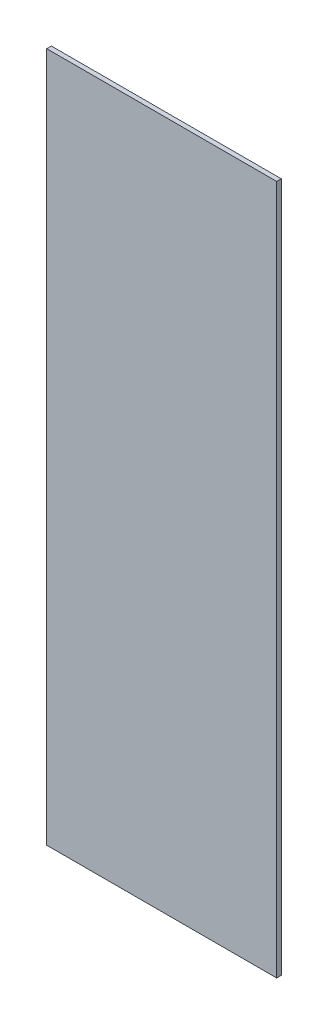
ISO-10303-21;
HEADER;
FILE_DESCRIPTION(('STEP AP214'),'2;1');
FILE_NAME('part.step','',(''),(''),'','','');
FILE_SCHEMA(('AUTOMOTIVE_DESIGN { 1 0 10303 214 1 1 1 1 }'));
ENDSEC;
DATA;
#1=APPLICATION_CONTEXT('core data for automotive mechanical design processes');
#2=APPLICATION_PROTOCOL_DEFINITION('international standard','automotive_design',2000,#1);
#3=PRODUCT_CONTEXT('',#1,'mechanical');
#4=PRODUCT('Part','Part','',(#3));
#5=PRODUCT_RELATED_PRODUCT_CATEGORY('part','',(#4));
#6=PRODUCT_DEFINITION_FORMATION('','',#4);
#7=PRODUCT_DEFINITION_CONTEXT('part definition',#1,'design');
#8=PRODUCT_DEFINITION('design','',#6,#7);
#9=PRODUCT_DEFINITION_SHAPE('','',#8);
#10=(LENGTH_UNIT() NAMED_UNIT(*) SI_UNIT(.MILLI.,.METRE.));
#11=(NAMED_UNIT(*) PLANE_ANGLE_UNIT() SI_UNIT($,.RADIAN.));
#12=(NAMED_UNIT(*) SI_UNIT($,.STERADIAN.) SOLID_ANGLE_UNIT());
#13=UNCERTAINTY_MEASURE_WITH_UNIT(LENGTH_MEASURE(1.E-05),#10,'distance_accuracy_value','');
#14=(GEOMETRIC_REPRESENTATION_CONTEXT(3) GLOBAL_UNCERTAINTY_ASSIGNED_CONTEXT((#13)) GLOBAL_UNIT_ASSIGNED_CONTEXT((#10,
#11,#12)) REPRESENTATION_CONTEXT('',''));
#15=CARTESIAN_POINT('',(0.,0.,0.));
#16=DIRECTION('',(0.,0.,1.));
#17=DIRECTION('',(1.,0.,0.));
#18=AXIS2_PLACEMENT_3D('',#15,#16,#17);
#19=CARTESIAN_POINT('',(-50.,-150.,2.));
#20=DIRECTION('',(1.,0.,0.));
#21=DIRECTION('',(0.,0.,-1.));
#22=AXIS2_PLACEMENT_3D('',#19,#20,#21);
#23=PLANE('',#22);
#24=DIRECTION('',(0.,-1.,0.));
#25=VECTOR('',#24,1.);
#26=CARTESIAN_POINT('',(-50.,-150.,0.));
#27=LINE('',#26,#25);
#28=CARTESIAN_POINT('',(-50.,150.,0.));
#29=VERTEX_POINT('',#28);
#30=CARTESIAN_POINT('',(-50.,-150.,0.));
#31=VERTEX_POINT('',#30);
#32=EDGE_CURVE('E107',#29,#31,#27,.T.);
#33=ORIENTED_EDGE('',*,*,#32,.T.);
#34=DIRECTION('',(0.,0.,-1.));
#35=VECTOR('',#34,1.);
#36=CARTESIAN_POINT('',(-50.,-150.,2.));
#37=LINE('',#36,#35);
#38=CARTESIAN_POINT('',(-50.,-150.,2.));
#39=VERTEX_POINT('',#38);
#40=EDGE_CURVE('E11',#39,#31,#37,.T.);
#41=ORIENTED_EDGE('',*,*,#40,.F.);
#42=DIRECTION('',(0.,-1.,0.));
#43=VECTOR('',#42,1.);
#44=CARTESIAN_POINT('',(-50.,-150.,2.));
#45=LINE('',#44,#43);
#46=CARTESIAN_POINT('',(-50.,150.,2.));
#47=VERTEX_POINT('',#46);
#48=EDGE_CURVE('E91',#47,#39,#45,.T.);
#49=ORIENTED_EDGE('',*,*,#48,.F.);
#50=DIRECTION('',(0.,0.,-1.));
#51=VECTOR('',#50,1.);
#52=CARTESIAN_POINT('',(-50.,150.,2.));
#53=LINE('',#52,#51);
#54=EDGE_CURVE('E103',#47,#29,#53,.T.);
#55=ORIENTED_EDGE('',*,*,#54,.T.);
#56=EDGE_LOOP('',(#33,#41,#49,#55));
#57=FACE_BOUND('',#56,.T.);
#58=ADVANCED_FACE('F39',(#57),#23,.F.);
#59=CARTESIAN_POINT('',(50.,-150.,2.));
#60=DIRECTION('',(0.,1.,0.));
#61=DIRECTION('',(0.,0.,1.));
#62=AXIS2_PLACEMENT_3D('',#59,#60,#61);
#63=PLANE('',#62);
#64=DIRECTION('',(1.,0.,0.));
#65=VECTOR('',#64,1.);
#66=CARTESIAN_POINT('',(50.,-150.,0.));
#67=LINE('',#66,#65);
#68=CARTESIAN_POINT('',(50.,-150.,0.));
#69=VERTEX_POINT('',#68);
#70=EDGE_CURVE('E96',#31,#69,#67,.T.);
#71=ORIENTED_EDGE('',*,*,#70,.T.);
#72=DIRECTION('',(0.,0.,-1.));
#73=VECTOR('',#72,1.);
#74=CARTESIAN_POINT('',(50.,-150.,2.));
#75=LINE('',#74,#73);
#76=CARTESIAN_POINT('',(50.,-150.,2.));
#77=VERTEX_POINT('',#76);
#78=EDGE_CURVE('E48',#77,#69,#75,.T.);
#79=ORIENTED_EDGE('',*,*,#78,.F.);
#80=DIRECTION('',(1.,0.,0.));
#81=VECTOR('',#80,1.);
#82=CARTESIAN_POINT('',(50.,-150.,2.));
#83=LINE('',#82,#81);
#84=EDGE_CURVE('E86',#39,#77,#83,.T.);
#85=ORIENTED_EDGE('',*,*,#84,.F.);
#86=ORIENTED_EDGE('',*,*,#40,.T.);
#87=EDGE_LOOP('',(#71,#79,#85,#86));
#88=FACE_BOUND('',#87,.T.);
#89=ADVANCED_FACE('F95',(#88),#63,.F.);
#90=CARTESIAN_POINT('',(50.,-150.,2.));
#91=DIRECTION('',(-1.,0.,0.));
#92=DIRECTION('',(0.,0.,1.));
#93=AXIS2_PLACEMENT_3D('',#90,#91,#92);
#94=PLANE('',#93);
#95=DIRECTION('',(0.,1.,0.));
#96=VECTOR('',#95,1.);
#97=CARTESIAN_POINT('',(50.,-150.,0.));
#98=LINE('',#97,#96);
#99=CARTESIAN_POINT('',(50.,150.,0.));
#100=VERTEX_POINT('',#99);
#101=EDGE_CURVE('E73',#69,#100,#98,.T.);
#102=ORIENTED_EDGE('',*,*,#101,.T.);
#103=DIRECTION('',(0.,0.,-1.));
#104=VECTOR('',#103,1.);
#105=CARTESIAN_POINT('',(50.,150.,2.));
#106=LINE('',#105,#104);
#107=CARTESIAN_POINT('',(50.,150.,2.));
#108=VERTEX_POINT('',#107);
#109=EDGE_CURVE('E98',#108,#100,#106,.T.);
#110=ORIENTED_EDGE('',*,*,#109,.F.);
#111=DIRECTION('',(0.,1.,0.));
#112=VECTOR('',#111,1.);
#113=CARTESIAN_POINT('',(50.,-150.,2.));
#114=LINE('',#113,#112);
#115=EDGE_CURVE('E89',#77,#108,#114,.T.);
#116=ORIENTED_EDGE('',*,*,#115,.F.);
#117=ORIENTED_EDGE('',*,*,#78,.T.);
#118=EDGE_LOOP('',(#102,#110,#116,#117));
#119=FACE_BOUND('',#118,.T.);
#120=ADVANCED_FACE('F99',(#119),#94,.F.);
#121=CARTESIAN_POINT('',(50.,150.,2.));
#122=DIRECTION('',(0.,-1.,0.));
#123=DIRECTION('',(1.,0.,0.));
#124=AXIS2_PLACEMENT_3D('',#121,#122,#123);
#125=PLANE('',#124);
#126=DIRECTION('',(-1.,0.,0.));
#127=VECTOR('',#126,1.);
#128=CARTESIAN_POINT('',(50.,150.,0.));
#129=LINE('',#128,#127);
#130=EDGE_CURVE('E79',#100,#29,#129,.T.);
#131=ORIENTED_EDGE('',*,*,#130,.T.);
#132=ORIENTED_EDGE('',*,*,#54,.F.);
#133=DIRECTION('',(-1.,0.,0.));
#134=VECTOR('',#133,1.);
#135=CARTESIAN_POINT('',(50.,150.,2.));
#136=LINE('',#135,#134);
#137=EDGE_CURVE('E56',#108,#47,#136,.T.);
#138=ORIENTED_EDGE('',*,*,#137,.F.);
#139=ORIENTED_EDGE('',*,*,#109,.T.);
#140=EDGE_LOOP('',(#131,#132,#138,#139));
#141=FACE_BOUND('',#140,.T.);
#142=ADVANCED_FACE('F120',(#141),#125,.F.);
#143=CARTESIAN_POINT('',(0.,0.,2.));
#144=DIRECTION('',(0.,0.,1.));
#145=DIRECTION('',(1.,0.,0.));
#146=AXIS2_PLACEMENT_3D('',#143,#144,#145);
#147=PLANE('',#146);
#148=ORIENTED_EDGE('',*,*,#48,.T.);
#149=ORIENTED_EDGE('',*,*,#84,.T.);
#150=ORIENTED_EDGE('',*,*,#115,.T.);
#151=ORIENTED_EDGE('',*,*,#137,.T.);
#152=EDGE_LOOP('',(#148,#149,#150,#151));
#153=FACE_BOUND('',#152,.T.);
#154=ADVANCED_FACE('F87',(#153),#147,.T.);
#155=CARTESIAN_POINT('',(0.,0.,0.));
#156=DIRECTION('',(0.,0.,1.));
#157=DIRECTION('',(1.,0.,0.));
#158=AXIS2_PLACEMENT_3D('',#155,#156,#157);
#159=PLANE('',#158);
#160=ORIENTED_EDGE('',*,*,#32,.F.);
#161=ORIENTED_EDGE('',*,*,#130,.F.);
#162=ORIENTED_EDGE('',*,*,#101,.F.);
#163=ORIENTED_EDGE('',*,*,#70,.F.);
#164=EDGE_LOOP('',(#160,#161,#162,#163));
#165=FACE_BOUND('',#164,.T.);
#166=ADVANCED_FACE('F123',(#165),#159,.F.);
#167=CLOSED_SHELL('',(#58,#89,#120,#142,#154,#166));
#168=MANIFOLD_SOLID_BREP('B2',#167);
#169=ADVANCED_BREP_SHAPE_REPRESENTATION('',(#18,#168),#14);
#170=SHAPE_DEFINITION_REPRESENTATION(#9,#169);
ENDSEC;
END-ISO-10303-21;
